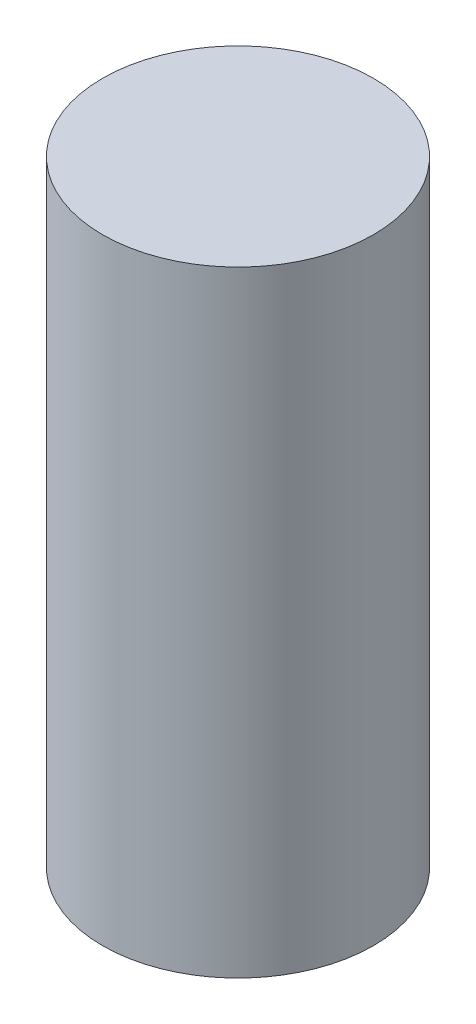
ISO-10303-21;
HEADER;
FILE_DESCRIPTION(('STEP AP214'),'2;1');
FILE_NAME('part.step','',(''),(''),'','','');
FILE_SCHEMA(('AUTOMOTIVE_DESIGN { 1 0 10303 214 1 1 1 1 }'));
ENDSEC;
DATA;
#1=APPLICATION_CONTEXT('core data for automotive mechanical design processes');
#2=APPLICATION_PROTOCOL_DEFINITION('international standard','automotive_design',2000,#1);
#3=PRODUCT_CONTEXT('',#1,'mechanical');
#4=PRODUCT('Part','Part','',(#3));
#5=PRODUCT_RELATED_PRODUCT_CATEGORY('part','',(#4));
#6=PRODUCT_DEFINITION_FORMATION('','',#4);
#7=PRODUCT_DEFINITION_CONTEXT('part definition',#1,'design');
#8=PRODUCT_DEFINITION('design','',#6,#7);
#9=PRODUCT_DEFINITION_SHAPE('','',#8);
#10=(LENGTH_UNIT() NAMED_UNIT(*) SI_UNIT(.MILLI.,.METRE.));
#11=(NAMED_UNIT(*) PLANE_ANGLE_UNIT() SI_UNIT($,.RADIAN.));
#12=(NAMED_UNIT(*) SI_UNIT($,.STERADIAN.) SOLID_ANGLE_UNIT());
#13=UNCERTAINTY_MEASURE_WITH_UNIT(LENGTH_MEASURE(1.E-05),#10,'distance_accuracy_value','');
#14=(GEOMETRIC_REPRESENTATION_CONTEXT(3) GLOBAL_UNCERTAINTY_ASSIGNED_CONTEXT((#13)) GLOBAL_UNIT_ASSIGNED_CONTEXT((#10,
#11,#12)) REPRESENTATION_CONTEXT('',''));
#15=CARTESIAN_POINT('',(0.,0.,0.));
#16=DIRECTION('',(0.,0.,1.));
#17=DIRECTION('',(1.,0.,0.));
#18=AXIS2_PLACEMENT_3D('',#15,#16,#17);
#19=CARTESIAN_POINT('',(0.,50.,0.));
#20=DIRECTION('',(0.,-1.,0.));
#21=DIRECTION('',(0.,0.,-1.));
#22=AXIS2_PLACEMENT_3D('',#19,#20,#21);
#23=CYLINDRICAL_SURFACE('',#22,11.);
#24=CARTESIAN_POINT('',(0.,50.,0.));
#25=DIRECTION('',(0.,1.,0.));
#26=DIRECTION('',(0.,0.,1.));
#27=AXIS2_PLACEMENT_3D('',#24,#25,#26);
#28=CIRCLE('',#27,11.);
#29=CARTESIAN_POINT('',(0.,50.,11.));
#30=VERTEX_POINT('',#29);
#31=EDGE_CURVE('E10',#30,#30,#28,.T.);
#32=ORIENTED_EDGE('',*,*,#31,.F.);
#33=EDGE_LOOP('',(#32));
#34=FACE_BOUND('',#33,.T.);
#35=CARTESIAN_POINT('',(0.,0.,0.));
#36=DIRECTION('',(0.,1.,0.));
#37=DIRECTION('',(0.,0.,1.));
#38=AXIS2_PLACEMENT_3D('',#35,#36,#37);
#39=CIRCLE('',#38,11.);
#40=CARTESIAN_POINT('',(0.,0.,11.));
#41=VERTEX_POINT('',#40);
#42=EDGE_CURVE('E34',#41,#41,#39,.T.);
#43=ORIENTED_EDGE('',*,*,#42,.T.);
#44=EDGE_LOOP('',(#43));
#45=FACE_BOUND('',#44,.T.);
#46=ADVANCED_FACE('F31',(#34,#45),#23,.T.);
#47=CARTESIAN_POINT('',(0.,50.,0.));
#48=DIRECTION('',(0.,1.,0.));
#49=DIRECTION('',(0.,0.,1.));
#50=AXIS2_PLACEMENT_3D('',#47,#48,#49);
#51=PLANE('',#50);
#52=ORIENTED_EDGE('',*,*,#31,.T.);
#53=EDGE_LOOP('',(#52));
#54=FACE_BOUND('',#53,.T.);
#55=ADVANCED_FACE('F46',(#54),#51,.T.);
#56=CARTESIAN_POINT('',(0.,0.,0.));
#57=DIRECTION('',(0.,1.,0.));
#58=DIRECTION('',(0.,0.,1.));
#59=AXIS2_PLACEMENT_3D('',#56,#57,#58);
#60=PLANE('',#59);
#61=ORIENTED_EDGE('',*,*,#42,.F.);
#62=EDGE_LOOP('',(#61));
#63=FACE_BOUND('',#62,.T.);
#64=ADVANCED_FACE('F44',(#63),#60,.F.);
#65=CLOSED_SHELL('',(#46,#55,#64));
#66=MANIFOLD_SOLID_BREP('B2',#65);
#67=ADVANCED_BREP_SHAPE_REPRESENTATION('',(#18,#66),#14);
#68=SHAPE_DEFINITION_REPRESENTATION(#9,#67);
ENDSEC;
END-ISO-10303-21;
